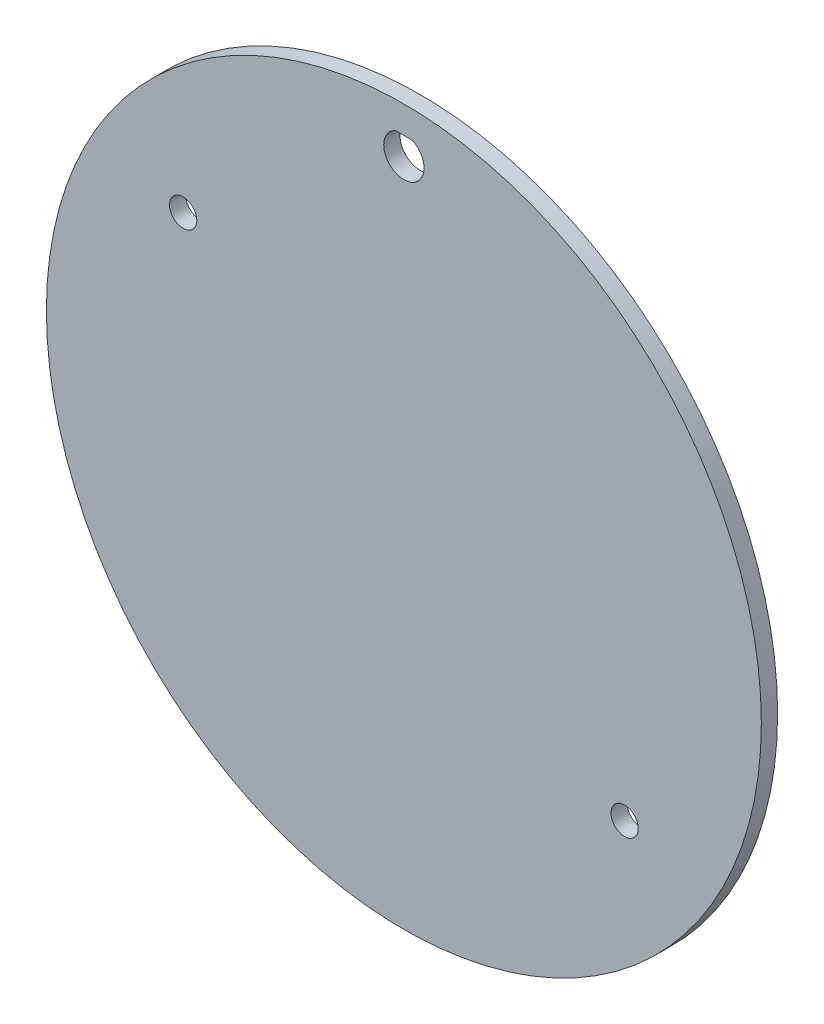
ISO-10303-21;
HEADER;
FILE_DESCRIPTION(('STEP AP214'),'2;1');
FILE_NAME('part.step','',(''),(''),'','','');
FILE_SCHEMA(('AUTOMOTIVE_DESIGN { 1 0 10303 214 1 1 1 1 }'));
ENDSEC;
DATA;
#1=APPLICATION_CONTEXT('core data for automotive mechanical design processes');
#2=APPLICATION_PROTOCOL_DEFINITION('international standard','automotive_design',2000,#1);
#3=PRODUCT_CONTEXT('',#1,'mechanical');
#4=PRODUCT('Part','Part','',(#3));
#5=PRODUCT_RELATED_PRODUCT_CATEGORY('part','',(#4));
#6=PRODUCT_DEFINITION_FORMATION('','',#4);
#7=PRODUCT_DEFINITION_CONTEXT('part definition',#1,'design');
#8=PRODUCT_DEFINITION('design','',#6,#7);
#9=PRODUCT_DEFINITION_SHAPE('','',#8);
#10=(LENGTH_UNIT() NAMED_UNIT(*) SI_UNIT(.MILLI.,.METRE.));
#11=(NAMED_UNIT(*) PLANE_ANGLE_UNIT() SI_UNIT($,.RADIAN.));
#12=(NAMED_UNIT(*) SI_UNIT($,.STERADIAN.) SOLID_ANGLE_UNIT());
#13=UNCERTAINTY_MEASURE_WITH_UNIT(LENGTH_MEASURE(1.E-05),#10,'distance_accuracy_value','');
#14=(GEOMETRIC_REPRESENTATION_CONTEXT(3) GLOBAL_UNCERTAINTY_ASSIGNED_CONTEXT((#13)) GLOBAL_UNIT_ASSIGNED_CONTEXT((#10,
#11,#12)) REPRESENTATION_CONTEXT('',''));
#15=CARTESIAN_POINT('',(0.,0.,0.));
#16=DIRECTION('',(0.,0.,1.));
#17=DIRECTION('',(1.,0.,0.));
#18=AXIS2_PLACEMENT_3D('',#15,#16,#17);
#19=CARTESIAN_POINT('',(0.,0.,2.5));
#20=DIRECTION('',(0.,0.,-1.));
#21=DIRECTION('',(-1.,0.,0.));
#22=AXIS2_PLACEMENT_3D('',#19,#20,#21);
#23=CYLINDRICAL_SURFACE('',#22,55.);
#24=CARTESIAN_POINT('',(0.,0.,2.5));
#25=DIRECTION('',(0.,0.,1.));
#26=DIRECTION('',(1.,0.,0.));
#27=AXIS2_PLACEMENT_3D('',#24,#25,#26);
#28=CIRCLE('',#27,55.);
#29=CARTESIAN_POINT('',(55.,0.,2.5));
#30=VERTEX_POINT('',#29);
#31=EDGE_CURVE('E89',#30,#30,#28,.T.);
#32=ORIENTED_EDGE('',*,*,#31,.F.);
#33=EDGE_LOOP('',(#32));
#34=FACE_BOUND('',#33,.T.);
#35=CARTESIAN_POINT('',(0.,0.,0.));
#36=DIRECTION('',(0.,0.,1.));
#37=DIRECTION('',(1.,0.,0.));
#38=AXIS2_PLACEMENT_3D('',#35,#36,#37);
#39=CIRCLE('',#38,55.);
#40=CARTESIAN_POINT('',(55.,0.,0.));
#41=VERTEX_POINT('',#40);
#42=EDGE_CURVE('E86',#41,#41,#39,.T.);
#43=ORIENTED_EDGE('',*,*,#42,.T.);
#44=EDGE_LOOP('',(#43));
#45=FACE_BOUND('',#44,.T.);
#46=ADVANCED_FACE('F36',(#34,#45),#23,.T.);
#47=CARTESIAN_POINT('',(0.,0.,2.5));
#48=DIRECTION('',(0.,0.,1.));
#49=DIRECTION('',(1.,0.,0.));
#50=AXIS2_PLACEMENT_3D('',#47,#48,#49);
#51=PLANE('',#50);
#52=CARTESIAN_POINT('',(0.,48.,2.5));
#53=DIRECTION('',(0.,0.,1.));
#54=DIRECTION('',(1.,0.,0.));
#55=AXIS2_PLACEMENT_3D('',#52,#53,#54);
#56=CIRCLE('',#55,3.1);
#57=CARTESIAN_POINT('',(-1.330413469565,50.8,2.5));
#58=VERTEX_POINT('',#57);
#59=CARTESIAN_POINT('',(1.330413469565,50.8,2.5));
#60=VERTEX_POINT('',#59);
#61=EDGE_CURVE('E50',#58,#60,#56,.T.);
#62=ORIENTED_EDGE('',*,*,#61,.F.);
#63=DIRECTION('',(-1.,0.,0.));
#64=VECTOR('',#63,1.);
#65=CARTESIAN_POINT('',(1.330413469565,50.8,2.5));
#66=LINE('',#65,#64);
#67=EDGE_CURVE('E68',#60,#58,#66,.T.);
#68=ORIENTED_EDGE('',*,*,#67,.F.);
#69=EDGE_LOOP('',(#62,#68));
#70=FACE_BOUND('',#69,.T.);
#71=CARTESIAN_POINT('',(-33.9599432734861,23.5374474999944,2.5));
#72=DIRECTION('',(0.,0.,1.));
#73=DIRECTION('',(1.,0.,0.));
#74=AXIS2_PLACEMENT_3D('',#71,#72,#73);
#75=CIRCLE('',#74,2.1);
#76=CARTESIAN_POINT('',(-31.8599432734861,23.5374474999944,2.5));
#77=VERTEX_POINT('',#76);
#78=EDGE_CURVE('E64',#77,#77,#75,.T.);
#79=ORIENTED_EDGE('',*,*,#78,.F.);
#80=EDGE_LOOP('',(#79));
#81=FACE_BOUND('',#80,.T.);
#82=CARTESIAN_POINT('',(33.9599432734856,-23.5374474999945,2.5));
#83=DIRECTION('',(0.,0.,1.));
#84=DIRECTION('',(1.,0.,0.));
#85=AXIS2_PLACEMENT_3D('',#82,#83,#84);
#86=CIRCLE('',#85,2.1);
#87=CARTESIAN_POINT('',(36.0599432734856,-23.5374474999945,2.5));
#88=VERTEX_POINT('',#87);
#89=EDGE_CURVE('E80',#88,#88,#86,.T.);
#90=ORIENTED_EDGE('',*,*,#89,.F.);
#91=EDGE_LOOP('',(#90));
#92=FACE_BOUND('',#91,.T.);
#93=ORIENTED_EDGE('',*,*,#31,.T.);
#94=EDGE_LOOP('',(#93));
#95=FACE_BOUND('',#94,.T.);
#96=ADVANCED_FACE('F72',(#70,#81,#92,#95),#51,.T.);
#97=CARTESIAN_POINT('',(0.,0.,0.));
#98=DIRECTION('',(0.,0.,1.));
#99=DIRECTION('',(1.,0.,0.));
#100=AXIS2_PLACEMENT_3D('',#97,#98,#99);
#101=PLANE('',#100);
#102=DIRECTION('',(-1.,0.,0.));
#103=VECTOR('',#102,1.);
#104=CARTESIAN_POINT('',(0.,50.8,0.));
#105=LINE('',#104,#103);
#106=CARTESIAN_POINT('',(1.330413469565,50.8,0.));
#107=VERTEX_POINT('',#106);
#108=CARTESIAN_POINT('',(-1.330413469565,50.8,0.));
#109=VERTEX_POINT('',#108);
#110=EDGE_CURVE('E43',#107,#109,#105,.T.);
#111=ORIENTED_EDGE('',*,*,#110,.T.);
#112=CARTESIAN_POINT('',(0.,48.,0.));
#113=DIRECTION('',(0.,0.,1.));
#114=DIRECTION('',(1.,0.,0.));
#115=AXIS2_PLACEMENT_3D('',#112,#113,#114);
#116=CIRCLE('',#115,3.1);
#117=EDGE_CURVE('E11',#109,#107,#116,.T.);
#118=ORIENTED_EDGE('',*,*,#117,.T.);
#119=EDGE_LOOP('',(#111,#118));
#120=FACE_BOUND('',#119,.T.);
#121=CARTESIAN_POINT('',(-33.9599432734861,23.5374474999944,0.));
#122=DIRECTION('',(0.,0.,1.));
#123=DIRECTION('',(1.,0.,0.));
#124=AXIS2_PLACEMENT_3D('',#121,#122,#123);
#125=CIRCLE('',#124,2.1);
#126=CARTESIAN_POINT('',(-31.8599432734861,23.5374474999944,0.));
#127=VERTEX_POINT('',#126);
#128=EDGE_CURVE('E77',#127,#127,#125,.T.);
#129=ORIENTED_EDGE('',*,*,#128,.T.);
#130=EDGE_LOOP('',(#129));
#131=FACE_BOUND('',#130,.T.);
#132=CARTESIAN_POINT('',(33.9599432734856,-23.5374474999945,0.));
#133=DIRECTION('',(0.,0.,1.));
#134=DIRECTION('',(1.,0.,0.));
#135=AXIS2_PLACEMENT_3D('',#132,#133,#134);
#136=CIRCLE('',#135,2.1);
#137=CARTESIAN_POINT('',(36.0599432734856,-23.5374474999945,0.));
#138=VERTEX_POINT('',#137);
#139=EDGE_CURVE('E83',#138,#138,#136,.T.);
#140=ORIENTED_EDGE('',*,*,#139,.T.);
#141=EDGE_LOOP('',(#140));
#142=FACE_BOUND('',#141,.T.);
#143=ORIENTED_EDGE('',*,*,#42,.F.);
#144=EDGE_LOOP('',(#143));
#145=FACE_BOUND('',#144,.T.);
#146=ADVANCED_FACE('F94',(#120,#131,#142,#145),#101,.F.);
#147=CARTESIAN_POINT('',(33.9599432734856,-23.5374474999945,0.));
#148=DIRECTION('',(0.,0.,1.));
#149=DIRECTION('',(1.,0.,0.));
#150=AXIS2_PLACEMENT_3D('',#147,#148,#149);
#151=CYLINDRICAL_SURFACE('',#150,2.1);
#152=ORIENTED_EDGE('',*,*,#139,.F.);
#153=EDGE_LOOP('',(#152));
#154=FACE_BOUND('',#153,.T.);
#155=ORIENTED_EDGE('',*,*,#89,.T.);
#156=EDGE_LOOP('',(#155));
#157=FACE_BOUND('',#156,.T.);
#158=ADVANCED_FACE('F97',(#154,#157),#151,.F.);
#159=CARTESIAN_POINT('',(-33.9599432734861,23.5374474999944,0.));
#160=DIRECTION('',(0.,0.,1.));
#161=DIRECTION('',(1.,0.,0.));
#162=AXIS2_PLACEMENT_3D('',#159,#160,#161);
#163=CYLINDRICAL_SURFACE('',#162,2.1);
#164=ORIENTED_EDGE('',*,*,#128,.F.);
#165=EDGE_LOOP('',(#164));
#166=FACE_BOUND('',#165,.T.);
#167=ORIENTED_EDGE('',*,*,#78,.T.);
#168=EDGE_LOOP('',(#167));
#169=FACE_BOUND('',#168,.T.);
#170=ADVANCED_FACE('F117',(#166,#169),#163,.F.);
#171=CARTESIAN_POINT('',(0.,48.,-7.5));
#172=DIRECTION('',(0.,0.,1.));
#173=DIRECTION('',(1.,0.,0.));
#174=AXIS2_PLACEMENT_3D('',#171,#172,#173);
#175=CYLINDRICAL_SURFACE('',#174,3.1);
#176=DIRECTION('',(0.,0.,1.));
#177=VECTOR('',#176,1.);
#178=CARTESIAN_POINT('',(-1.330413469565,50.8,-7.5));
#179=LINE('',#178,#177);
#180=EDGE_CURVE('E57',#109,#58,#179,.T.);
#181=ORIENTED_EDGE('',*,*,#180,.T.);
#182=ORIENTED_EDGE('',*,*,#61,.T.);
#183=DIRECTION('',(0.,0.,1.));
#184=VECTOR('',#183,1.);
#185=CARTESIAN_POINT('',(1.330413469565,50.8,-7.5));
#186=LINE('',#185,#184);
#187=EDGE_CURVE('E65',#107,#60,#186,.T.);
#188=ORIENTED_EDGE('',*,*,#187,.F.);
#189=ORIENTED_EDGE('',*,*,#117,.F.);
#190=EDGE_LOOP('',(#181,#182,#188,#189));
#191=FACE_BOUND('',#190,.T.);
#192=ADVANCED_FACE('F62',(#191),#175,.F.);
#193=CARTESIAN_POINT('',(1.330413469565,50.8,-7.5));
#194=DIRECTION('',(0.,1.,0.));
#195=DIRECTION('',(0.,0.,1.));
#196=AXIS2_PLACEMENT_3D('',#193,#194,#195);
#197=PLANE('',#196);
#198=ORIENTED_EDGE('',*,*,#187,.T.);
#199=ORIENTED_EDGE('',*,*,#67,.T.);
#200=ORIENTED_EDGE('',*,*,#180,.F.);
#201=ORIENTED_EDGE('',*,*,#110,.F.);
#202=EDGE_LOOP('',(#198,#199,#200,#201));
#203=FACE_BOUND('',#202,.T.);
#204=ADVANCED_FACE('F69',(#203),#197,.F.);
#205=CLOSED_SHELL('',(#46,#96,#146,#158,#170,#192,#204));
#206=MANIFOLD_SOLID_BREP('B2',#205);
#207=ADVANCED_BREP_SHAPE_REPRESENTATION('',(#18,#206),#14);
#208=SHAPE_DEFINITION_REPRESENTATION(#9,#207);
ENDSEC;
END-ISO-10303-21;
